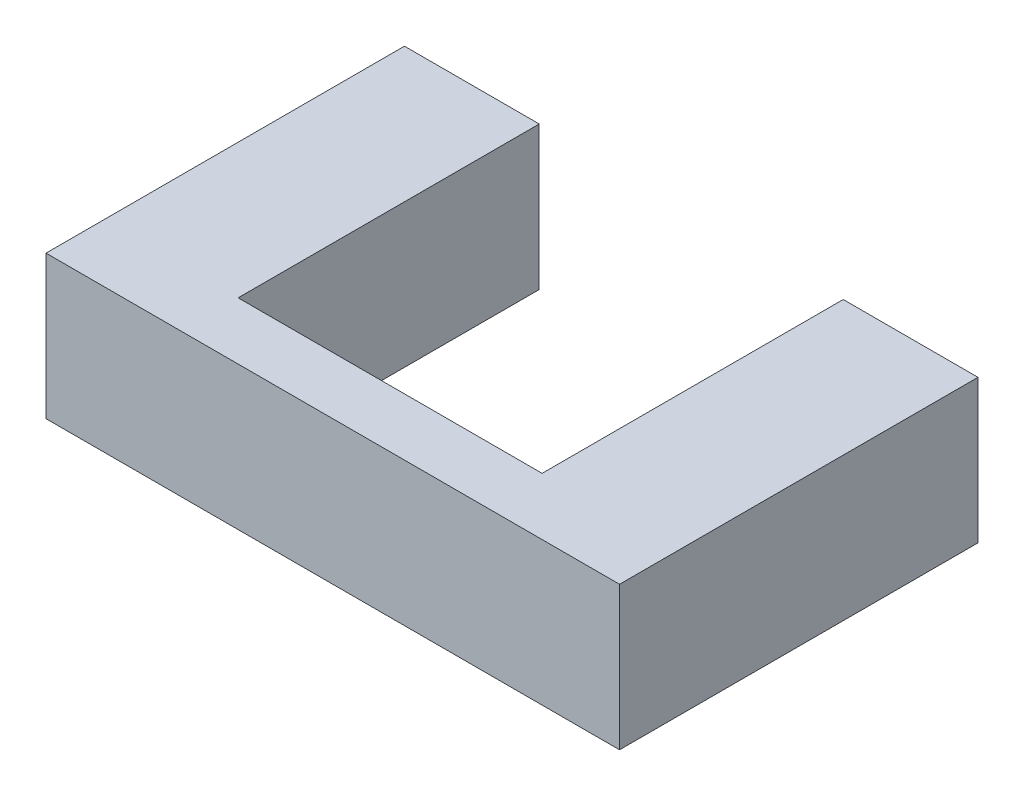
ISO-10303-21;
HEADER;
FILE_DESCRIPTION(('STEP AP214'),'2;1');
FILE_NAME('part.step','',(''),(''),'','','');
FILE_SCHEMA(('AUTOMOTIVE_DESIGN { 1 0 10303 214 1 1 1 1 }'));
ENDSEC;
DATA;
#1=APPLICATION_CONTEXT('core data for automotive mechanical design processes');
#2=APPLICATION_PROTOCOL_DEFINITION('international standard','automotive_design',2000,#1);
#3=PRODUCT_CONTEXT('',#1,'mechanical');
#4=PRODUCT('Part','Part','',(#3));
#5=PRODUCT_RELATED_PRODUCT_CATEGORY('part','',(#4));
#6=PRODUCT_DEFINITION_FORMATION('','',#4);
#7=PRODUCT_DEFINITION_CONTEXT('part definition',#1,'design');
#8=PRODUCT_DEFINITION('design','',#6,#7);
#9=PRODUCT_DEFINITION_SHAPE('','',#8);
#10=(LENGTH_UNIT() NAMED_UNIT(*) SI_UNIT(.MILLI.,.METRE.));
#11=(NAMED_UNIT(*) PLANE_ANGLE_UNIT() SI_UNIT($,.RADIAN.));
#12=(NAMED_UNIT(*) SI_UNIT($,.STERADIAN.) SOLID_ANGLE_UNIT());
#13=UNCERTAINTY_MEASURE_WITH_UNIT(LENGTH_MEASURE(1.E-05),#10,'distance_accuracy_value','');
#14=(GEOMETRIC_REPRESENTATION_CONTEXT(3) GLOBAL_UNCERTAINTY_ASSIGNED_CONTEXT((#13)) GLOBAL_UNIT_ASSIGNED_CONTEXT((#10,
#11,#12)) REPRESENTATION_CONTEXT('',''));
#15=CARTESIAN_POINT('',(0.,0.,0.));
#16=DIRECTION('',(0.,0.,1.));
#17=DIRECTION('',(1.,0.,0.));
#18=AXIS2_PLACEMENT_3D('',#15,#16,#17);
#19=CARTESIAN_POINT('',(-25.4,12.7,-15.875));
#20=DIRECTION('',(0.,0.,1.));
#21=DIRECTION('',(1.,0.,0.));
#22=AXIS2_PLACEMENT_3D('',#19,#20,#21);
#23=PLANE('',#22);
#24=DIRECTION('',(-1.,0.,0.));
#25=VECTOR('',#24,1.);
#26=CARTESIAN_POINT('',(-25.4,0.,-15.875));
#27=LINE('',#26,#25);
#28=CARTESIAN_POINT('',(25.4,0.,-15.875));
#29=VERTEX_POINT('',#28);
#30=CARTESIAN_POINT('',(13.462,0.,-15.875));
#31=VERTEX_POINT('',#30);
#32=EDGE_CURVE('E122',#29,#31,#27,.T.);
#33=ORIENTED_EDGE('',*,*,#32,.T.);
#34=DIRECTION('',(0.,1.,0.));
#35=VECTOR('',#34,1.);
#36=CARTESIAN_POINT('',(13.462,0.,-15.875));
#37=LINE('',#36,#35);
#38=CARTESIAN_POINT('',(13.462,12.7,-15.875));
#39=VERTEX_POINT('',#38);
#40=EDGE_CURVE('E110',#31,#39,#37,.T.);
#41=ORIENTED_EDGE('',*,*,#40,.T.);
#42=DIRECTION('',(-1.,0.,0.));
#43=VECTOR('',#42,1.);
#44=CARTESIAN_POINT('',(-25.4,12.7,-15.875));
#45=LINE('',#44,#43);
#46=CARTESIAN_POINT('',(25.4,12.7,-15.875));
#47=VERTEX_POINT('',#46);
#48=EDGE_CURVE('E88',#47,#39,#45,.T.);
#49=ORIENTED_EDGE('',*,*,#48,.F.);
#50=DIRECTION('',(0.,-1.,0.));
#51=VECTOR('',#50,1.);
#52=CARTESIAN_POINT('',(25.4,12.7,-15.875));
#53=LINE('',#52,#51);
#54=EDGE_CURVE('E11',#47,#29,#53,.T.);
#55=ORIENTED_EDGE('',*,*,#54,.T.);
#56=EDGE_LOOP('',(#33,#41,#49,#55));
#57=FACE_BOUND('',#56,.T.);
#58=ADVANCED_FACE('F36',(#57),#23,.F.);
#59=CARTESIAN_POINT('',(25.4,12.7,-15.875));
#60=DIRECTION('',(-1.,0.,0.));
#61=DIRECTION('',(0.,0.,1.));
#62=AXIS2_PLACEMENT_3D('',#59,#60,#61);
#63=PLANE('',#62);
#64=DIRECTION('',(0.,0.,-1.));
#65=VECTOR('',#64,1.);
#66=CARTESIAN_POINT('',(25.4,0.,-15.875));
#67=LINE('',#66,#65);
#68=CARTESIAN_POINT('',(25.4,0.,15.875));
#69=VERTEX_POINT('',#68);
#70=EDGE_CURVE('E133',#69,#29,#67,.T.);
#71=ORIENTED_EDGE('',*,*,#70,.T.);
#72=ORIENTED_EDGE('',*,*,#54,.F.);
#73=DIRECTION('',(0.,0.,-1.));
#74=VECTOR('',#73,1.);
#75=CARTESIAN_POINT('',(25.4,12.7,-15.875));
#76=LINE('',#75,#74);
#77=CARTESIAN_POINT('',(25.4,12.7,15.875));
#78=VERTEX_POINT('',#77);
#79=EDGE_CURVE('E138',#78,#47,#76,.T.);
#80=ORIENTED_EDGE('',*,*,#79,.F.);
#81=DIRECTION('',(0.,-1.,0.));
#82=VECTOR('',#81,1.);
#83=CARTESIAN_POINT('',(25.4,12.7,15.875));
#84=LINE('',#83,#82);
#85=EDGE_CURVE('E139',#78,#69,#84,.T.);
#86=ORIENTED_EDGE('',*,*,#85,.T.);
#87=EDGE_LOOP('',(#71,#72,#80,#86));
#88=FACE_BOUND('',#87,.T.);
#89=ADVANCED_FACE('F38',(#88),#63,.F.);
#90=CARTESIAN_POINT('',(-13.462,12.7,-15.875));
#91=VERTEX_POINT('',#90);
#92=CARTESIAN_POINT('',(-25.4,12.7,-15.875));
#93=VERTEX_POINT('',#92);
#94=EDGE_CURVE('E164',#91,#93,#45,.T.);
#95=ORIENTED_EDGE('',*,*,#94,.F.);
#96=DIRECTION('',(0.,1.,0.));
#97=VECTOR('',#96,1.);
#98=CARTESIAN_POINT('',(-13.462,0.,-15.875));
#99=LINE('',#98,#97);
#100=CARTESIAN_POINT('',(-13.462,0.,-15.875));
#101=VERTEX_POINT('',#100);
#102=EDGE_CURVE('E117',#101,#91,#99,.T.);
#103=ORIENTED_EDGE('',*,*,#102,.F.);
#104=CARTESIAN_POINT('',(-25.4,0.,-15.875));
#105=VERTEX_POINT('',#104);
#106=EDGE_CURVE('E130',#101,#105,#27,.T.);
#107=ORIENTED_EDGE('',*,*,#106,.T.);
#108=DIRECTION('',(0.,-1.,0.));
#109=VECTOR('',#108,1.);
#110=CARTESIAN_POINT('',(-25.4,12.7,-15.875));
#111=LINE('',#110,#109);
#112=EDGE_CURVE('E44',#93,#105,#111,.T.);
#113=ORIENTED_EDGE('',*,*,#112,.F.);
#114=EDGE_LOOP('',(#95,#103,#107,#113));
#115=FACE_BOUND('',#114,.T.);
#116=ADVANCED_FACE('F179',(#115),#23,.F.);
#117=CARTESIAN_POINT('',(-25.4,12.7,-15.875));
#118=DIRECTION('',(1.,0.,0.));
#119=DIRECTION('',(0.,0.,-1.));
#120=AXIS2_PLACEMENT_3D('',#117,#118,#119);
#121=PLANE('',#120);
#122=DIRECTION('',(0.,0.,1.));
#123=VECTOR('',#122,1.);
#124=CARTESIAN_POINT('',(-25.4,0.,-15.875));
#125=LINE('',#124,#123);
#126=CARTESIAN_POINT('',(-25.4,0.,15.875));
#127=VERTEX_POINT('',#126);
#128=EDGE_CURVE('E129',#105,#127,#125,.T.);
#129=ORIENTED_EDGE('',*,*,#128,.T.);
#130=DIRECTION('',(0.,-1.,0.));
#131=VECTOR('',#130,1.);
#132=CARTESIAN_POINT('',(-25.4,12.7,15.875));
#133=LINE('',#132,#131);
#134=CARTESIAN_POINT('',(-25.4,12.7,15.875));
#135=VERTEX_POINT('',#134);
#136=EDGE_CURVE('E141',#135,#127,#133,.T.);
#137=ORIENTED_EDGE('',*,*,#136,.F.);
#138=DIRECTION('',(0.,0.,1.));
#139=VECTOR('',#138,1.);
#140=CARTESIAN_POINT('',(-25.4,12.7,-15.875));
#141=LINE('',#140,#139);
#142=EDGE_CURVE('E149',#93,#135,#141,.T.);
#143=ORIENTED_EDGE('',*,*,#142,.F.);
#144=ORIENTED_EDGE('',*,*,#112,.T.);
#145=EDGE_LOOP('',(#129,#137,#143,#144));
#146=FACE_BOUND('',#145,.T.);
#147=ADVANCED_FACE('F147',(#146),#121,.F.);
#148=CARTESIAN_POINT('',(-25.4,12.7,15.875));
#149=DIRECTION('',(0.,0.,-1.));
#150=DIRECTION('',(-1.,0.,0.));
#151=AXIS2_PLACEMENT_3D('',#148,#149,#150);
#152=PLANE('',#151);
#153=DIRECTION('',(1.,0.,0.));
#154=VECTOR('',#153,1.);
#155=CARTESIAN_POINT('',(-25.4,0.,15.875));
#156=LINE('',#155,#154);
#157=EDGE_CURVE('E81',#127,#69,#156,.T.);
#158=ORIENTED_EDGE('',*,*,#157,.T.);
#159=ORIENTED_EDGE('',*,*,#85,.F.);
#160=DIRECTION('',(1.,0.,0.));
#161=VECTOR('',#160,1.);
#162=CARTESIAN_POINT('',(-25.4,12.7,15.875));
#163=LINE('',#162,#161);
#164=EDGE_CURVE('E60',#135,#78,#163,.T.);
#165=ORIENTED_EDGE('',*,*,#164,.F.);
#166=ORIENTED_EDGE('',*,*,#136,.T.);
#167=EDGE_LOOP('',(#158,#159,#165,#166));
#168=FACE_BOUND('',#167,.T.);
#169=ADVANCED_FACE('F168',(#168),#152,.F.);
#170=CARTESIAN_POINT('',(0.,12.7,0.));
#171=DIRECTION('',(0.,1.,0.));
#172=DIRECTION('',(0.,0.,1.));
#173=AXIS2_PLACEMENT_3D('',#170,#171,#172);
#174=PLANE('',#173);
#175=DIRECTION('',(0.,0.,-1.));
#176=VECTOR('',#175,1.);
#177=CARTESIAN_POINT('',(13.462,12.7,-15.875));
#178=LINE('',#177,#176);
#179=CARTESIAN_POINT('',(13.462,12.7,10.795));
#180=VERTEX_POINT('',#179);
#181=EDGE_CURVE('E115',#180,#39,#178,.T.);
#182=ORIENTED_EDGE('',*,*,#181,.F.);
#183=DIRECTION('',(1.,0.,0.));
#184=VECTOR('',#183,1.);
#185=CARTESIAN_POINT('',(13.462,12.7,10.795));
#186=LINE('',#185,#184);
#187=CARTESIAN_POINT('',(-13.462,12.7,10.795));
#188=VERTEX_POINT('',#187);
#189=EDGE_CURVE('E125',#188,#180,#186,.T.);
#190=ORIENTED_EDGE('',*,*,#189,.F.);
#191=DIRECTION('',(0.,0.,1.));
#192=VECTOR('',#191,1.);
#193=CARTESIAN_POINT('',(-13.462,12.7,-15.875));
#194=LINE('',#193,#192);
#195=EDGE_CURVE('E171',#91,#188,#194,.T.);
#196=ORIENTED_EDGE('',*,*,#195,.F.);
#197=ORIENTED_EDGE('',*,*,#94,.T.);
#198=ORIENTED_EDGE('',*,*,#142,.T.);
#199=ORIENTED_EDGE('',*,*,#164,.T.);
#200=ORIENTED_EDGE('',*,*,#79,.T.);
#201=ORIENTED_EDGE('',*,*,#48,.T.);
#202=EDGE_LOOP('',(#182,#190,#196,#197,#198,#199,#200,#201));
#203=FACE_BOUND('',#202,.T.);
#204=ADVANCED_FACE('F166',(#203),#174,.T.);
#205=CARTESIAN_POINT('',(0.,0.,0.));
#206=DIRECTION('',(0.,1.,0.));
#207=DIRECTION('',(0.,0.,1.));
#208=AXIS2_PLACEMENT_3D('',#205,#206,#207);
#209=PLANE('',#208);
#210=DIRECTION('',(1.,0.,0.));
#211=VECTOR('',#210,1.);
#212=CARTESIAN_POINT('',(13.462,0.,10.795));
#213=LINE('',#212,#211);
#214=CARTESIAN_POINT('',(-13.462,0.,10.795));
#215=VERTEX_POINT('',#214);
#216=CARTESIAN_POINT('',(13.462,0.,10.795));
#217=VERTEX_POINT('',#216);
#218=EDGE_CURVE('E51',#215,#217,#213,.T.);
#219=ORIENTED_EDGE('',*,*,#218,.T.);
#220=DIRECTION('',(0.,0.,-1.));
#221=VECTOR('',#220,1.);
#222=CARTESIAN_POINT('',(13.462,0.,-15.875));
#223=LINE('',#222,#221);
#224=EDGE_CURVE('E113',#217,#31,#223,.T.);
#225=ORIENTED_EDGE('',*,*,#224,.T.);
#226=ORIENTED_EDGE('',*,*,#32,.F.);
#227=ORIENTED_EDGE('',*,*,#70,.F.);
#228=ORIENTED_EDGE('',*,*,#157,.F.);
#229=ORIENTED_EDGE('',*,*,#128,.F.);
#230=ORIENTED_EDGE('',*,*,#106,.F.);
#231=DIRECTION('',(0.,0.,1.));
#232=VECTOR('',#231,1.);
#233=CARTESIAN_POINT('',(-13.462,0.,-15.875));
#234=LINE('',#233,#232);
#235=EDGE_CURVE('E124',#101,#215,#234,.T.);
#236=ORIENTED_EDGE('',*,*,#235,.T.);
#237=EDGE_LOOP('',(#219,#225,#226,#227,#228,#229,#230,#236));
#238=FACE_BOUND('',#237,.T.);
#239=ADVANCED_FACE('F120',(#238),#209,.F.);
#240=CARTESIAN_POINT('',(13.462,0.,-15.875));
#241=DIRECTION('',(1.,0.,0.));
#242=DIRECTION('',(0.,0.,-1.));
#243=AXIS2_PLACEMENT_3D('',#240,#241,#242);
#244=PLANE('',#243);
#245=ORIENTED_EDGE('',*,*,#181,.T.);
#246=ORIENTED_EDGE('',*,*,#40,.F.);
#247=ORIENTED_EDGE('',*,*,#224,.F.);
#248=DIRECTION('',(0.,1.,0.));
#249=VECTOR('',#248,1.);
#250=CARTESIAN_POINT('',(13.462,0.,10.795));
#251=LINE('',#250,#249);
#252=EDGE_CURVE('E154',#217,#180,#251,.T.);
#253=ORIENTED_EDGE('',*,*,#252,.T.);
#254=EDGE_LOOP('',(#245,#246,#247,#253));
#255=FACE_BOUND('',#254,.T.);
#256=ADVANCED_FACE('F112',(#255),#244,.F.);
#257=CARTESIAN_POINT('',(13.462,0.,10.795));
#258=DIRECTION('',(0.,0.,1.));
#259=DIRECTION('',(1.,0.,0.));
#260=AXIS2_PLACEMENT_3D('',#257,#258,#259);
#261=PLANE('',#260);
#262=ORIENTED_EDGE('',*,*,#189,.T.);
#263=ORIENTED_EDGE('',*,*,#252,.F.);
#264=ORIENTED_EDGE('',*,*,#218,.F.);
#265=DIRECTION('',(0.,1.,0.));
#266=VECTOR('',#265,1.);
#267=CARTESIAN_POINT('',(-13.462,0.,10.795));
#268=LINE('',#267,#266);
#269=EDGE_CURVE('E155',#215,#188,#268,.T.);
#270=ORIENTED_EDGE('',*,*,#269,.T.);
#271=EDGE_LOOP('',(#262,#263,#264,#270));
#272=FACE_BOUND('',#271,.T.);
#273=ADVANCED_FACE('F228',(#272),#261,.F.);
#274=CARTESIAN_POINT('',(-13.462,0.,-15.875));
#275=DIRECTION('',(-1.,0.,0.));
#276=DIRECTION('',(0.,0.,1.));
#277=AXIS2_PLACEMENT_3D('',#274,#275,#276);
#278=PLANE('',#277);
#279=ORIENTED_EDGE('',*,*,#195,.T.);
#280=ORIENTED_EDGE('',*,*,#269,.F.);
#281=ORIENTED_EDGE('',*,*,#235,.F.);
#282=ORIENTED_EDGE('',*,*,#102,.T.);
#283=EDGE_LOOP('',(#279,#280,#281,#282));
#284=FACE_BOUND('',#283,.T.);
#285=ADVANCED_FACE('F178',(#284),#278,.F.);
#286=CLOSED_SHELL('',(#58,#89,#116,#147,#169,#204,#239,#256,#273,#285));
#287=MANIFOLD_SOLID_BREP('B2',#286);
#288=ADVANCED_BREP_SHAPE_REPRESENTATION('',(#18,#287),#14);
#289=SHAPE_DEFINITION_REPRESENTATION(#9,#288);
ENDSEC;
END-ISO-10303-21;
